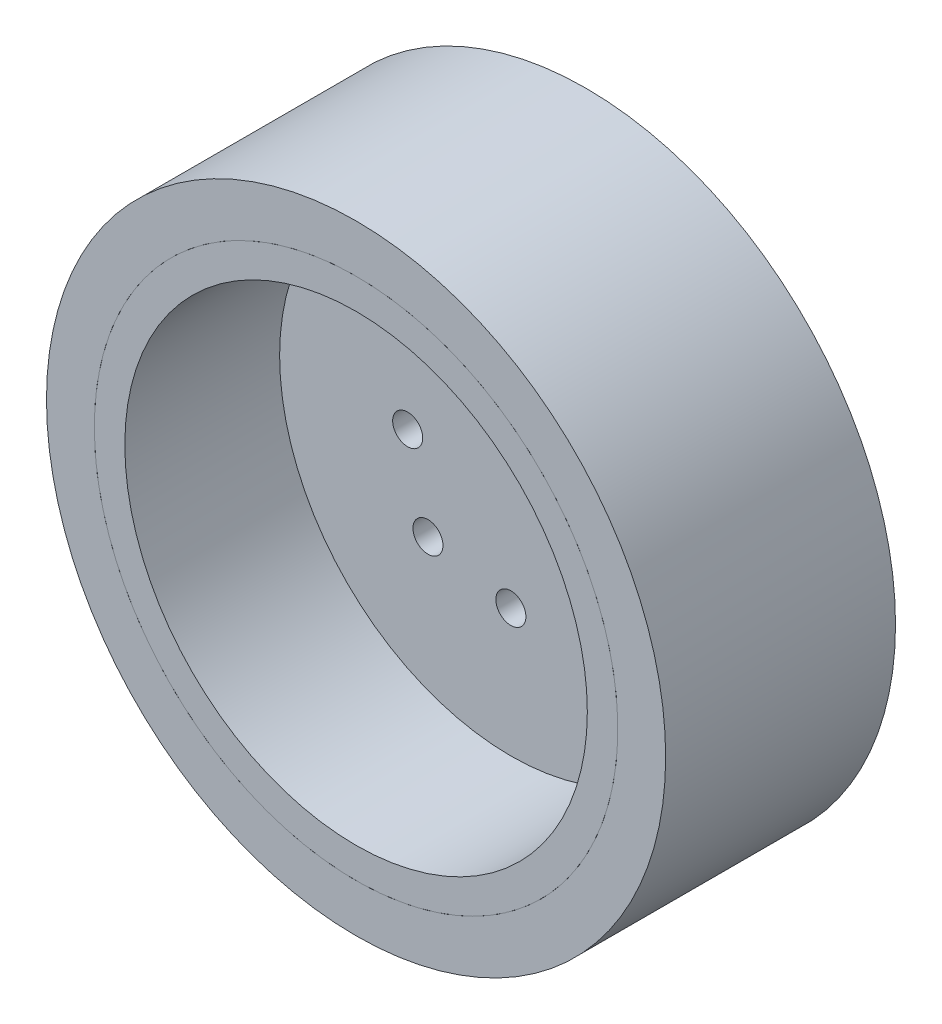
ISO-10303-21;
HEADER;
FILE_DESCRIPTION(('STEP AP214'),'2;1');
FILE_NAME('part.step','',(''),(''),'','','');
FILE_SCHEMA(('AUTOMOTIVE_DESIGN { 1 0 10303 214 1 1 1 1 }'));
ENDSEC;
DATA;
#1=APPLICATION_CONTEXT('core data for automotive mechanical design processes');
#2=APPLICATION_PROTOCOL_DEFINITION('international standard','automotive_design',2000,#1);
#3=PRODUCT_CONTEXT('',#1,'mechanical');
#4=PRODUCT('Part','Part','',(#3));
#5=PRODUCT_RELATED_PRODUCT_CATEGORY('part','',(#4));
#6=PRODUCT_DEFINITION_FORMATION('','',#4);
#7=PRODUCT_DEFINITION_CONTEXT('part definition',#1,'design');
#8=PRODUCT_DEFINITION('design','',#6,#7);
#9=PRODUCT_DEFINITION_SHAPE('','',#8);
#10=(LENGTH_UNIT() NAMED_UNIT(*) SI_UNIT(.MILLI.,.METRE.));
#11=(NAMED_UNIT(*) PLANE_ANGLE_UNIT() SI_UNIT($,.RADIAN.));
#12=(NAMED_UNIT(*) SI_UNIT($,.STERADIAN.) SOLID_ANGLE_UNIT());
#13=UNCERTAINTY_MEASURE_WITH_UNIT(LENGTH_MEASURE(1.E-05),#10,'distance_accuracy_value','');
#14=(GEOMETRIC_REPRESENTATION_CONTEXT(3) GLOBAL_UNCERTAINTY_ASSIGNED_CONTEXT((#13)) GLOBAL_UNIT_ASSIGNED_CONTEXT((#10,
#11,#12)) REPRESENTATION_CONTEXT('',''));
#15=CARTESIAN_POINT('',(0.,0.,0.));
#16=DIRECTION('',(0.,0.,1.));
#17=DIRECTION('',(1.,0.,0.));
#18=AXIS2_PLACEMENT_3D('',#15,#16,#17);
#19=CARTESIAN_POINT('',(-33.,0.,0.));
#20=DIRECTION('',(0.,0.,-1.));
#21=DIRECTION('',(-1.,0.,0.));
#22=AXIS2_PLACEMENT_3D('',#19,#20,#21);
#23=PLANE('',#22);
#24=CARTESIAN_POINT('',(0.,0.,0.));
#25=DIRECTION('',(0.,0.,-1.));
#26=DIRECTION('',(-1.,0.,0.));
#27=AXIS2_PLACEMENT_3D('',#24,#25,#26);
#28=CIRCLE('',#27,33.);
#29=CARTESIAN_POINT('',(-33.,0.,0.));
#30=VERTEX_POINT('',#29);
#31=EDGE_CURVE('E80',#30,#30,#28,.T.);
#32=ORIENTED_EDGE('',*,*,#31,.T.);
#33=EDGE_LOOP('',(#32));
#34=FACE_BOUND('',#33,.T.);
#35=CARTESIAN_POINT('',(0.,0.,0.));
#36=DIRECTION('',(0.,0.,-1.));
#37=DIRECTION('',(-1.,0.,0.));
#38=AXIS2_PLACEMENT_3D('',#35,#36,#37);
#39=CIRCLE('',#38,27.9);
#40=CARTESIAN_POINT('',(-27.9,0.,0.));
#41=VERTEX_POINT('',#40);
#42=EDGE_CURVE('E11',#41,#41,#39,.T.);
#43=ORIENTED_EDGE('',*,*,#42,.F.);
#44=EDGE_LOOP('',(#43));
#45=FACE_BOUND('',#44,.T.);
#46=ADVANCED_FACE('F52',(#34,#45),#23,.T.);
#47=CARTESIAN_POINT('',(0.,0.,-0.338387196240575));
#48=DIRECTION('',(0.,0.,-1.));
#49=DIRECTION('',(-1.,0.,0.));
#50=AXIS2_PLACEMENT_3D('',#47,#48,#49);
#51=CYLINDRICAL_SURFACE('',#50,27.9);
#52=ORIENTED_EDGE('',*,*,#42,.T.);
#53=EDGE_LOOP('',(#52));
#54=FACE_BOUND('',#53,.T.);
#55=CARTESIAN_POINT('',(0.,0.,1.5));
#56=DIRECTION('',(0.,0.,-1.));
#57=DIRECTION('',(-1.,0.,0.));
#58=AXIS2_PLACEMENT_3D('',#55,#56,#57);
#59=CIRCLE('',#58,27.9);
#60=CARTESIAN_POINT('',(-27.9,0.,1.5));
#61=VERTEX_POINT('',#60);
#62=EDGE_CURVE('E58',#61,#61,#59,.T.);
#63=ORIENTED_EDGE('',*,*,#62,.F.);
#64=EDGE_LOOP('',(#63));
#65=FACE_BOUND('',#64,.T.);
#66=ADVANCED_FACE('F98',(#54,#65),#51,.F.);
#67=CARTESIAN_POINT('',(-27.9,0.,1.5));
#68=DIRECTION('',(0.,0.,-1.));
#69=DIRECTION('',(-1.,0.,0.));
#70=AXIS2_PLACEMENT_3D('',#67,#68,#69);
#71=PLANE('',#70);
#72=ORIENTED_EDGE('',*,*,#62,.T.);
#73=EDGE_LOOP('',(#72));
#74=FACE_BOUND('',#73,.T.);
#75=CARTESIAN_POINT('',(0.,0.,1.5));
#76=DIRECTION('',(0.,0.,-1.));
#77=DIRECTION('',(-1.,0.,0.));
#78=AXIS2_PLACEMENT_3D('',#75,#76,#77);
#79=CIRCLE('',#78,26.4);
#80=CARTESIAN_POINT('',(-26.4,0.,1.5));
#81=VERTEX_POINT('',#80);
#82=EDGE_CURVE('E62',#81,#81,#79,.T.);
#83=ORIENTED_EDGE('',*,*,#82,.F.);
#84=EDGE_LOOP('',(#83));
#85=FACE_BOUND('',#84,.T.);
#86=ADVANCED_FACE('F102',(#74,#85),#71,.T.);
#87=CARTESIAN_POINT('',(0.,0.,-0.338387196240575));
#88=DIRECTION('',(0.,0.,-1.));
#89=DIRECTION('',(-1.,0.,0.));
#90=AXIS2_PLACEMENT_3D('',#87,#88,#89);
#91=CYLINDRICAL_SURFACE('',#90,26.4);
#92=ORIENTED_EDGE('',*,*,#82,.T.);
#93=EDGE_LOOP('',(#92));
#94=FACE_BOUND('',#93,.T.);
#95=CARTESIAN_POINT('',(0.,0.,23.));
#96=DIRECTION('',(0.,0.,-1.));
#97=DIRECTION('',(-1.,0.,0.));
#98=AXIS2_PLACEMENT_3D('',#95,#96,#97);
#99=CIRCLE('',#98,26.4);
#100=CARTESIAN_POINT('',(-26.4,0.,23.));
#101=VERTEX_POINT('',#100);
#102=EDGE_CURVE('E66',#101,#101,#99,.T.);
#103=ORIENTED_EDGE('',*,*,#102,.F.);
#104=EDGE_LOOP('',(#103));
#105=FACE_BOUND('',#104,.T.);
#106=ADVANCED_FACE('F106',(#94,#105),#91,.F.);
#107=CARTESIAN_POINT('',(-26.4,0.,23.));
#108=DIRECTION('',(0.,0.,1.));
#109=DIRECTION('',(1.,0.,0.));
#110=AXIS2_PLACEMENT_3D('',#107,#108,#109);
#111=PLANE('',#110);
#112=ORIENTED_EDGE('',*,*,#102,.T.);
#113=EDGE_LOOP('',(#112));
#114=FACE_BOUND('',#113,.T.);
#115=CARTESIAN_POINT('',(0.,0.,23.));
#116=DIRECTION('',(0.,0.,-1.));
#117=DIRECTION('',(-1.,0.,0.));
#118=AXIS2_PLACEMENT_3D('',#115,#116,#117);
#119=CIRCLE('',#118,27.9);
#120=CARTESIAN_POINT('',(-27.9,0.,23.));
#121=VERTEX_POINT('',#120);
#122=EDGE_CURVE('E71',#121,#121,#119,.T.);
#123=ORIENTED_EDGE('',*,*,#122,.F.);
#124=EDGE_LOOP('',(#123));
#125=FACE_BOUND('',#124,.T.);
#126=ADVANCED_FACE('F112',(#114,#125),#111,.T.);
#127=CARTESIAN_POINT('',(0.,0.,-0.338387196240575));
#128=DIRECTION('',(0.,0.,-1.));
#129=DIRECTION('',(-1.,0.,0.));
#130=AXIS2_PLACEMENT_3D('',#127,#128,#129);
#131=CYLINDRICAL_SURFACE('',#130,27.9);
#132=ORIENTED_EDGE('',*,*,#122,.T.);
#133=EDGE_LOOP('',(#132));
#134=FACE_BOUND('',#133,.T.);
#135=CARTESIAN_POINT('',(0.,0.,24.5));
#136=DIRECTION('',(0.,0.,-1.));
#137=DIRECTION('',(-1.,0.,0.));
#138=AXIS2_PLACEMENT_3D('',#135,#136,#137);
#139=CIRCLE('',#138,27.9);
#140=CARTESIAN_POINT('',(-27.9,0.,24.5));
#141=VERTEX_POINT('',#140);
#142=EDGE_CURVE('E74',#141,#141,#139,.T.);
#143=ORIENTED_EDGE('',*,*,#142,.F.);
#144=EDGE_LOOP('',(#143));
#145=FACE_BOUND('',#144,.T.);
#146=ADVANCED_FACE('F94',(#134,#145),#131,.F.);
#147=CARTESIAN_POINT('',(-33.,0.,24.5));
#148=DIRECTION('',(0.,0.,1.));
#149=DIRECTION('',(1.,0.,0.));
#150=AXIS2_PLACEMENT_3D('',#147,#148,#149);
#151=PLANE('',#150);
#152=ORIENTED_EDGE('',*,*,#142,.T.);
#153=EDGE_LOOP('',(#152));
#154=FACE_BOUND('',#153,.T.);
#155=CARTESIAN_POINT('',(0.,0.,24.5));
#156=DIRECTION('',(0.,0.,-1.));
#157=DIRECTION('',(-1.,0.,0.));
#158=AXIS2_PLACEMENT_3D('',#155,#156,#157);
#159=CIRCLE('',#158,33.);
#160=CARTESIAN_POINT('',(-33.,0.,24.5));
#161=VERTEX_POINT('',#160);
#162=EDGE_CURVE('E77',#161,#161,#159,.T.);
#163=ORIENTED_EDGE('',*,*,#162,.F.);
#164=EDGE_LOOP('',(#163));
#165=FACE_BOUND('',#164,.T.);
#166=ADVANCED_FACE('F88',(#154,#165),#151,.T.);
#167=CARTESIAN_POINT('',(0.,0.,-0.338387196240575));
#168=DIRECTION('',(0.,0.,-1.));
#169=DIRECTION('',(-1.,0.,0.));
#170=AXIS2_PLACEMENT_3D('',#167,#168,#169);
#171=CYLINDRICAL_SURFACE('',#170,33.);
#172=ORIENTED_EDGE('',*,*,#162,.T.);
#173=EDGE_LOOP('',(#172));
#174=FACE_BOUND('',#173,.T.);
#175=ORIENTED_EDGE('',*,*,#31,.F.);
#176=EDGE_LOOP('',(#175));
#177=FACE_BOUND('',#176,.T.);
#178=ADVANCED_FACE('F86',(#174,#177),#171,.T.);
#179=CLOSED_SHELL('',(#46,#66,#86,#106,#126,#146,#166,#178));
#180=MANIFOLD_SOLID_BREP('B2',#179);
#181=CARTESIAN_POINT('',(0.,0.,24.5));
#182=DIRECTION('',(0.,0.,-1.));
#183=DIRECTION('',(-1.,0.,0.));
#184=AXIS2_PLACEMENT_3D('',#181,#182,#183);
#185=CYLINDRICAL_SURFACE('',#184,26.4);
#186=CARTESIAN_POINT('',(0.,0.,23.));
#187=DIRECTION('',(0.,0.,1.));
#188=DIRECTION('',(1.,0.,0.));
#189=AXIS2_PLACEMENT_3D('',#186,#187,#188);
#190=CIRCLE('',#189,26.4);
#191=CARTESIAN_POINT('',(26.4,0.,23.));
#192=VERTEX_POINT('',#191);
#193=EDGE_CURVE('E181',#192,#192,#190,.T.);
#194=ORIENTED_EDGE('',*,*,#193,.F.);
#195=EDGE_LOOP('',(#194));
#196=FACE_BOUND('',#195,.T.);
#197=CARTESIAN_POINT('',(0.,0.,1.5));
#198=DIRECTION('',(0.,0.,-1.));
#199=DIRECTION('',(-1.,0.,0.));
#200=AXIS2_PLACEMENT_3D('',#197,#198,#199);
#201=CIRCLE('',#200,26.4);
#202=CARTESIAN_POINT('',(-26.4,0.,1.5));
#203=VERTEX_POINT('',#202);
#204=EDGE_CURVE('E51',#203,#203,#201,.T.);
#205=ORIENTED_EDGE('',*,*,#204,.F.);
#206=EDGE_LOOP('',(#205));
#207=FACE_BOUND('',#206,.T.);
#208=ADVANCED_FACE('F175',(#196,#207),#185,.T.);
#209=CARTESIAN_POINT('',(0.,0.,24.5));
#210=DIRECTION('',(0.,0.,1.));
#211=DIRECTION('',(1.,0.,0.));
#212=AXIS2_PLACEMENT_3D('',#209,#210,#211);
#213=PLANE('',#212);
#214=CARTESIAN_POINT('',(0.,0.,24.5));
#215=DIRECTION('',(0.,0.,1.));
#216=DIRECTION('',(1.,0.,0.));
#217=AXIS2_PLACEMENT_3D('',#214,#215,#216);
#218=CIRCLE('',#217,24.65);
#219=CARTESIAN_POINT('',(24.65,0.,24.5));
#220=VERTEX_POINT('',#219);
#221=EDGE_CURVE('E189',#220,#220,#218,.T.);
#222=ORIENTED_EDGE('',*,*,#221,.F.);
#223=EDGE_LOOP('',(#222));
#224=FACE_BOUND('',#223,.T.);
#225=CARTESIAN_POINT('',(0.,0.,24.5));
#226=DIRECTION('',(0.,0.,1.));
#227=DIRECTION('',(1.,0.,0.));
#228=AXIS2_PLACEMENT_3D('',#225,#226,#227);
#229=CIRCLE('',#228,27.9);
#230=CARTESIAN_POINT('',(27.9,0.,24.5));
#231=VERTEX_POINT('',#230);
#232=EDGE_CURVE('E195',#231,#231,#229,.T.);
#233=ORIENTED_EDGE('',*,*,#232,.T.);
#234=EDGE_LOOP('',(#233));
#235=FACE_BOUND('',#234,.T.);
#236=ADVANCED_FACE('F285',(#224,#235),#213,.T.);
#237=CARTESIAN_POINT('',(0.,0.,-69.7207286249936));
#238=DIRECTION('',(0.,0.,1.));
#239=DIRECTION('',(1.,0.,0.));
#240=AXIS2_PLACEMENT_3D('',#237,#238,#239);
#241=CYLINDRICAL_SURFACE('',#240,24.65);
#242=CARTESIAN_POINT('',(0.,0.,8.00000000000001));
#243=DIRECTION('',(0.,0.,1.));
#244=DIRECTION('',(1.,0.,0.));
#245=AXIS2_PLACEMENT_3D('',#242,#243,#244);
#246=CIRCLE('',#245,24.65);
#247=CARTESIAN_POINT('',(24.65,0.,7.99999999999999));
#248=VERTEX_POINT('',#247);
#249=EDGE_CURVE('E185',#248,#248,#246,.F.);
#250=CARTESIAN_POINT('',(24.65,0.,7.99999999999999));
#251=CARTESIAN_POINT('',(24.65,0.,8.17187499999999));
#252=CARTESIAN_POINT('',(24.65,0.,8.34375));
#253=CARTESIAN_POINT('',(24.65,0.,8.6875));
#254=CARTESIAN_POINT('',(24.65,0.,8.85937499999999));
#255=CARTESIAN_POINT('',(24.65,0.,9.20312499999999));
#256=CARTESIAN_POINT('',(24.65,0.,9.37499999999999));
#257=CARTESIAN_POINT('',(24.65,0.,9.71874999999999));
#258=CARTESIAN_POINT('',(24.65,0.,9.89062499999999));
#259=CARTESIAN_POINT('',(24.65,0.,10.234375));
#260=CARTESIAN_POINT('',(24.65,0.,10.40625));
#261=CARTESIAN_POINT('',(24.65,0.,10.75));
#262=CARTESIAN_POINT('',(24.65,0.,10.921875));
#263=CARTESIAN_POINT('',(24.65,0.,11.265625));
#264=CARTESIAN_POINT('',(24.65,0.,11.4375));
#265=CARTESIAN_POINT('',(24.65,0.,11.78125));
#266=CARTESIAN_POINT('',(24.65,0.,11.953125));
#267=CARTESIAN_POINT('',(24.65,0.,12.296875));
#268=CARTESIAN_POINT('',(24.65,0.,12.46875));
#269=CARTESIAN_POINT('',(24.65,0.,12.8125));
#270=CARTESIAN_POINT('',(24.65,0.,12.984375));
#271=CARTESIAN_POINT('',(24.65,0.,13.328125));
#272=CARTESIAN_POINT('',(24.65,0.,13.5));
#273=CARTESIAN_POINT('',(24.65,0.,13.84375));
#274=CARTESIAN_POINT('',(24.65,0.,14.015625));
#275=CARTESIAN_POINT('',(24.65,0.,14.359375));
#276=CARTESIAN_POINT('',(24.65,0.,14.53125));
#277=CARTESIAN_POINT('',(24.65,0.,14.875));
#278=CARTESIAN_POINT('',(24.65,0.,15.046875));
#279=CARTESIAN_POINT('',(24.65,0.,15.390625));
#280=CARTESIAN_POINT('',(24.65,0.,15.5625));
#281=CARTESIAN_POINT('',(24.65,0.,15.90625));
#282=CARTESIAN_POINT('',(24.65,0.,16.078125));
#283=CARTESIAN_POINT('',(24.65,0.,16.421875));
#284=CARTESIAN_POINT('',(24.65,0.,16.59375));
#285=CARTESIAN_POINT('',(24.65,0.,16.9375));
#286=CARTESIAN_POINT('',(24.65,0.,17.109375));
#287=CARTESIAN_POINT('',(24.65,0.,17.453125));
#288=CARTESIAN_POINT('',(24.65,0.,17.625));
#289=CARTESIAN_POINT('',(24.65,0.,17.96875));
#290=CARTESIAN_POINT('',(24.65,0.,18.140625));
#291=CARTESIAN_POINT('',(24.65,0.,18.484375));
#292=CARTESIAN_POINT('',(24.65,0.,18.65625));
#293=CARTESIAN_POINT('',(24.65,0.,19.));
#294=CARTESIAN_POINT('',(24.65,0.,19.171875));
#295=CARTESIAN_POINT('',(24.65,0.,19.515625));
#296=CARTESIAN_POINT('',(24.65,0.,19.6875));
#297=CARTESIAN_POINT('',(24.65,0.,20.03125));
#298=CARTESIAN_POINT('',(24.65,0.,20.203125));
#299=CARTESIAN_POINT('',(24.65,0.,20.546875));
#300=CARTESIAN_POINT('',(24.65,0.,20.71875));
#301=CARTESIAN_POINT('',(24.65,0.,21.0625));
#302=CARTESIAN_POINT('',(24.65,0.,21.234375));
#303=CARTESIAN_POINT('',(24.65,0.,21.578125));
#304=CARTESIAN_POINT('',(24.65,0.,21.75));
#305=CARTESIAN_POINT('',(24.65,0.,22.09375));
#306=CARTESIAN_POINT('',(24.65,0.,22.265625));
#307=CARTESIAN_POINT('',(24.65,0.,22.609375));
#308=CARTESIAN_POINT('',(24.65,0.,22.78125));
#309=CARTESIAN_POINT('',(24.65,0.,23.125));
#310=CARTESIAN_POINT('',(24.65,0.,23.296875));
#311=CARTESIAN_POINT('',(24.65,0.,23.640625));
#312=CARTESIAN_POINT('',(24.65,0.,23.8125));
#313=CARTESIAN_POINT('',(24.65,0.,24.15625));
#314=CARTESIAN_POINT('',(24.65,0.,24.328125));
#315=CARTESIAN_POINT('',(24.65,0.,24.5));
#316=B_SPLINE_CURVE_WITH_KNOTS('',3,(#250,#251,#252,#253,#254,#255,#256,#257,#258,#259,#260,
#261,#262,#263,#264,#265,#266,#267,#268,#269,#270,#271,#272,#273,#274,#275,#276,#277,#278,#279,
#280,#281,#282,#283,#284,#285,#286,#287,#288,#289,#290,#291,#292,#293,#294,#295,#296,#297,#298,
#299,#300,#301,#302,#303,#304,#305,#306,#307,#308,#309,#310,#311,#312,#313,#314,#315),
.UNSPECIFIED.,.F.,.F.,(4,2,2,2,2,2,2,2,2,2,2,2,2,2,2,2,2,2,2,2,2,2,2,2,2,2,2,2,2,2,2,2,4),(0.,
0.515625000000006,1.03125,1.546875,2.06249999999999,2.578125,3.09375000000001,3.609375,4.125,
4.64062500000001,5.15625,5.67187500000001,6.18750000000001,6.703125,7.21875000000001,7.734375,
8.25000000000001,8.76562500000001,9.28125000000001,9.79687500000001,10.3125,10.828125,11.34375,
11.859375,12.375,12.890625,13.40625,13.921875,14.4375,14.953125,15.46875,15.984375,16.5),.UNSPECIFIED.);
#317=EDGE_CURVE('BSEAM291',#248,#220,#316,.T.);
#318=ORIENTED_EDGE('',*,*,#249,.T.);
#319=ORIENTED_EDGE('',*,*,#221,.T.);
#320=ORIENTED_EDGE('',*,*,#317,.T.);
#321=ORIENTED_EDGE('',*,*,#317,.F.);
#322=EDGE_LOOP('',(#318,#320,#319,#321));
#323=FACE_BOUND('',#322,.T.);
#324=ADVANCED_FACE('F291',(#323),#241,.F.);
#325=CARTESIAN_POINT('',(0.,0.,8.));
#326=DIRECTION('',(0.,0.,1.));
#327=DIRECTION('',(1.,0.,0.));
#328=AXIS2_PLACEMENT_3D('',#325,#326,#327);
#329=PLANE('',#328);
#330=CARTESIAN_POINT('',(-8.83883476483185,8.83883476483184,8.));
#331=DIRECTION('',(0.,0.,1.));
#332=DIRECTION('',(1.,0.,0.));
#333=AXIS2_PLACEMENT_3D('',#330,#331,#332);
#334=CIRCLE('',#333,1.6);
#335=CARTESIAN_POINT('',(-7.23883476483184,8.83883476483184,8.));
#336=VERTEX_POINT('',#335);
#337=EDGE_CURVE('E204',#336,#336,#334,.T.);
#338=ORIENTED_EDGE('',*,*,#337,.F.);
#339=EDGE_LOOP('',(#338));
#340=FACE_BOUND('',#339,.T.);
#341=CARTESIAN_POINT('',(11.,0.,8.));
#342=DIRECTION('',(0.,0.,1.));
#343=DIRECTION('',(1.,0.,0.));
#344=AXIS2_PLACEMENT_3D('',#341,#342,#343);
#345=CIRCLE('',#344,1.6);
#346=CARTESIAN_POINT('',(12.6,0.,8.));
#347=VERTEX_POINT('',#346);
#348=EDGE_CURVE('E209',#347,#347,#345,.T.);
#349=ORIENTED_EDGE('',*,*,#348,.F.);
#350=EDGE_LOOP('',(#349));
#351=FACE_BOUND('',#350,.T.);
#352=CARTESIAN_POINT('',(0.,-11.,8.));
#353=DIRECTION('',(0.,0.,1.));
#354=DIRECTION('',(1.,0.,0.));
#355=AXIS2_PLACEMENT_3D('',#352,#353,#354);
#356=CIRCLE('',#355,1.6);
#357=CARTESIAN_POINT('',(1.6,-11.,8.));
#358=VERTEX_POINT('',#357);
#359=EDGE_CURVE('E212',#358,#358,#356,.T.);
#360=ORIENTED_EDGE('',*,*,#359,.F.);
#361=EDGE_LOOP('',(#360));
#362=FACE_BOUND('',#361,.T.);
#363=CARTESIAN_POINT('',(-11.,0.,8.));
#364=DIRECTION('',(0.,0.,1.));
#365=DIRECTION('',(1.,0.,0.));
#366=AXIS2_PLACEMENT_3D('',#363,#364,#365);
#367=CIRCLE('',#366,1.6);
#368=CARTESIAN_POINT('',(-9.4,0.,8.));
#369=VERTEX_POINT('',#368);
#370=EDGE_CURVE('E215',#369,#369,#367,.T.);
#371=ORIENTED_EDGE('',*,*,#370,.F.);
#372=EDGE_LOOP('',(#371));
#373=FACE_BOUND('',#372,.T.);
#374=CARTESIAN_POINT('',(8.83883476483184,8.83883476483185,8.));
#375=DIRECTION('',(0.,0.,1.));
#376=DIRECTION('',(1.,0.,0.));
#377=AXIS2_PLACEMENT_3D('',#374,#375,#376);
#378=CIRCLE('',#377,1.6);
#379=CARTESIAN_POINT('',(10.4388347648318,8.83883476483185,8.));
#380=VERTEX_POINT('',#379);
#381=EDGE_CURVE('E218',#380,#380,#378,.T.);
#382=ORIENTED_EDGE('',*,*,#381,.F.);
#383=EDGE_LOOP('',(#382));
#384=FACE_BOUND('',#383,.T.);
#385=CARTESIAN_POINT('',(8.83883476483184,-8.83883476483185,8.));
#386=DIRECTION('',(0.,0.,1.));
#387=DIRECTION('',(1.,0.,0.));
#388=AXIS2_PLACEMENT_3D('',#385,#386,#387);
#389=CIRCLE('',#388,1.6);
#390=CARTESIAN_POINT('',(10.4388347648318,-8.83883476483185,8.));
#391=VERTEX_POINT('',#390);
#392=EDGE_CURVE('E221',#391,#391,#389,.T.);
#393=ORIENTED_EDGE('',*,*,#392,.F.);
#394=EDGE_LOOP('',(#393));
#395=FACE_BOUND('',#394,.T.);
#396=CARTESIAN_POINT('',(-8.83883476483184,-8.83883476483184,8.));
#397=DIRECTION('',(0.,0.,1.));
#398=DIRECTION('',(1.,0.,0.));
#399=AXIS2_PLACEMENT_3D('',#396,#397,#398);
#400=CIRCLE('',#399,1.6);
#401=CARTESIAN_POINT('',(-7.23883476483183,-8.83883476483184,8.));
#402=VERTEX_POINT('',#401);
#403=EDGE_CURVE('E224',#402,#402,#400,.T.);
#404=ORIENTED_EDGE('',*,*,#403,.F.);
#405=EDGE_LOOP('',(#404));
#406=FACE_BOUND('',#405,.T.);
#407=CARTESIAN_POINT('',(0.,11.,8.));
#408=DIRECTION('',(0.,0.,1.));
#409=DIRECTION('',(1.,0.,0.));
#410=AXIS2_PLACEMENT_3D('',#407,#408,#409);
#411=CIRCLE('',#410,1.6);
#412=CARTESIAN_POINT('',(1.6,11.,8.));
#413=VERTEX_POINT('',#412);
#414=EDGE_CURVE('E227',#413,#413,#411,.T.);
#415=ORIENTED_EDGE('',*,*,#414,.F.);
#416=EDGE_LOOP('',(#415));
#417=FACE_BOUND('',#416,.T.);
#418=ORIENTED_EDGE('',*,*,#249,.F.);
#419=EDGE_LOOP('',(#418));
#420=FACE_BOUND('',#419,.T.);
#421=ADVANCED_FACE('F299',(#340,#351,#362,#373,#384,#395,#406,#417,#420),#329,.T.);
#422=CARTESIAN_POINT('',(0.,0.,23.));
#423=DIRECTION('',(0.,0.,1.));
#424=DIRECTION('',(1.,0.,0.));
#425=AXIS2_PLACEMENT_3D('',#422,#423,#424);
#426=CYLINDRICAL_SURFACE('',#425,27.9);
#427=CARTESIAN_POINT('',(0.,0.,23.));
#428=DIRECTION('',(0.,0.,1.));
#429=DIRECTION('',(1.,0.,0.));
#430=AXIS2_PLACEMENT_3D('',#427,#428,#429);
#431=CIRCLE('',#430,27.9);
#432=CARTESIAN_POINT('',(27.9,0.,23.));
#433=VERTEX_POINT('',#432);
#434=EDGE_CURVE('E194',#433,#433,#431,.T.);
#435=ORIENTED_EDGE('',*,*,#434,.T.);
#436=EDGE_LOOP('',(#435));
#437=FACE_BOUND('',#436,.T.);
#438=ORIENTED_EDGE('',*,*,#232,.F.);
#439=EDGE_LOOP('',(#438));
#440=FACE_BOUND('',#439,.T.);
#441=ADVANCED_FACE('F306',(#437,#440),#426,.T.);
#442=CARTESIAN_POINT('',(0.,0.,23.));
#443=DIRECTION('',(0.,0.,1.));
#444=DIRECTION('',(1.,0.,0.));
#445=AXIS2_PLACEMENT_3D('',#442,#443,#444);
#446=PLANE('',#445);
#447=ORIENTED_EDGE('',*,*,#193,.T.);
#448=EDGE_LOOP('',(#447));
#449=FACE_BOUND('',#448,.T.);
#450=ORIENTED_EDGE('',*,*,#434,.F.);
#451=EDGE_LOOP('',(#450));
#452=FACE_BOUND('',#451,.T.);
#453=ADVANCED_FACE('F279',(#449,#452),#446,.F.);
#454=CARTESIAN_POINT('',(0.,0.,1.5));
#455=DIRECTION('',(0.,0.,-1.));
#456=DIRECTION('',(1.,0.,0.));
#457=AXIS2_PLACEMENT_3D('',#454,#455,#456);
#458=PLANE('',#457);
#459=CARTESIAN_POINT('',(0.,0.,1.5));
#460=DIRECTION('',(0.,0.,1.));
#461=DIRECTION('',(1.,0.,0.));
#462=AXIS2_PLACEMENT_3D('',#459,#460,#461);
#463=CIRCLE('',#462,27.9);
#464=CARTESIAN_POINT('',(27.9,0.,1.5));
#465=VERTEX_POINT('',#464);
#466=EDGE_CURVE('E198',#465,#465,#463,.T.);
#467=ORIENTED_EDGE('',*,*,#466,.T.);
#468=EDGE_LOOP('',(#467));
#469=FACE_BOUND('',#468,.T.);
#470=ORIENTED_EDGE('',*,*,#204,.T.);
#471=EDGE_LOOP('',(#470));
#472=FACE_BOUND('',#471,.T.);
#473=ADVANCED_FACE('F272',(#469,#472),#458,.F.);
#474=CARTESIAN_POINT('',(0.,0.,1.5));
#475=DIRECTION('',(0.,0.,-1.));
#476=DIRECTION('',(-1.,0.,0.));
#477=AXIS2_PLACEMENT_3D('',#474,#475,#476);
#478=CYLINDRICAL_SURFACE('',#477,27.9);
#479=ORIENTED_EDGE('',*,*,#466,.F.);
#480=EDGE_LOOP('',(#479));
#481=FACE_BOUND('',#480,.T.);
#482=CARTESIAN_POINT('',(0.,0.,0.));
#483=DIRECTION('',(0.,0.,1.));
#484=DIRECTION('',(1.,0.,0.));
#485=AXIS2_PLACEMENT_3D('',#482,#483,#484);
#486=CIRCLE('',#485,27.9);
#487=CARTESIAN_POINT('',(27.9,0.,0.));
#488=VERTEX_POINT('',#487);
#489=EDGE_CURVE('E201',#488,#488,#486,.T.);
#490=ORIENTED_EDGE('',*,*,#489,.T.);
#491=EDGE_LOOP('',(#490));
#492=FACE_BOUND('',#491,.T.);
#493=ADVANCED_FACE('F261',(#481,#492),#478,.T.);
#494=CARTESIAN_POINT('',(0.,0.,0.));
#495=DIRECTION('',(0.,0.,1.));
#496=DIRECTION('',(1.,0.,0.));
#497=AXIS2_PLACEMENT_3D('',#494,#495,#496);
#498=PLANE('',#497);
#499=CARTESIAN_POINT('',(-8.83883476483185,8.83883476483184,0.));
#500=DIRECTION('',(0.,0.,-1.));
#501=DIRECTION('',(-1.,0.,0.));
#502=AXIS2_PLACEMENT_3D('',#499,#500,#501);
#503=CIRCLE('',#502,1.6);
#504=CARTESIAN_POINT('',(-10.4388347648318,8.83883476483184,0.));
#505=VERTEX_POINT('',#504);
#506=EDGE_CURVE('E240',#505,#505,#503,.T.);
#507=ORIENTED_EDGE('',*,*,#506,.F.);
#508=EDGE_LOOP('',(#507));
#509=FACE_BOUND('',#508,.T.);
#510=CARTESIAN_POINT('',(11.,0.,0.));
#511=DIRECTION('',(0.,0.,-1.));
#512=DIRECTION('',(-1.,0.,0.));
#513=AXIS2_PLACEMENT_3D('',#510,#511,#512);
#514=CIRCLE('',#513,1.6);
#515=CARTESIAN_POINT('',(9.4,0.,0.));
#516=VERTEX_POINT('',#515);
#517=EDGE_CURVE('E237',#516,#516,#514,.T.);
#518=ORIENTED_EDGE('',*,*,#517,.F.);
#519=EDGE_LOOP('',(#518));
#520=FACE_BOUND('',#519,.T.);
#521=CARTESIAN_POINT('',(0.,-11.,0.));
#522=DIRECTION('',(0.,0.,-1.));
#523=DIRECTION('',(-1.,0.,0.));
#524=AXIS2_PLACEMENT_3D('',#521,#522,#523);
#525=CIRCLE('',#524,1.6);
#526=CARTESIAN_POINT('',(-1.6,-11.,0.));
#527=VERTEX_POINT('',#526);
#528=EDGE_CURVE('E234',#527,#527,#525,.T.);
#529=ORIENTED_EDGE('',*,*,#528,.F.);
#530=EDGE_LOOP('',(#529));
#531=FACE_BOUND('',#530,.T.);
#532=CARTESIAN_POINT('',(-11.,0.,0.));
#533=DIRECTION('',(0.,0.,-1.));
#534=DIRECTION('',(-1.,0.,0.));
#535=AXIS2_PLACEMENT_3D('',#532,#533,#534);
#536=CIRCLE('',#535,1.6);
#537=CARTESIAN_POINT('',(-12.6,0.,0.));
#538=VERTEX_POINT('',#537);
#539=EDGE_CURVE('E233',#538,#538,#536,.T.);
#540=ORIENTED_EDGE('',*,*,#539,.F.);
#541=EDGE_LOOP('',(#540));
#542=FACE_BOUND('',#541,.T.);
#543=CARTESIAN_POINT('',(8.83883476483184,8.83883476483185,0.));
#544=DIRECTION('',(0.,0.,-1.));
#545=DIRECTION('',(-1.,0.,0.));
#546=AXIS2_PLACEMENT_3D('',#543,#544,#545);
#547=CIRCLE('',#546,1.6);
#548=CARTESIAN_POINT('',(7.23883476483184,8.83883476483185,0.));
#549=VERTEX_POINT('',#548);
#550=EDGE_CURVE('E243',#549,#549,#547,.T.);
#551=ORIENTED_EDGE('',*,*,#550,.F.);
#552=EDGE_LOOP('',(#551));
#553=FACE_BOUND('',#552,.T.);
#554=CARTESIAN_POINT('',(8.83883476483184,-8.83883476483185,0.));
#555=DIRECTION('',(0.,0.,-1.));
#556=DIRECTION('',(-1.,0.,0.));
#557=AXIS2_PLACEMENT_3D('',#554,#555,#556);
#558=CIRCLE('',#557,1.6);
#559=CARTESIAN_POINT('',(7.23883476483184,-8.83883476483185,0.));
#560=VERTEX_POINT('',#559);
#561=EDGE_CURVE('E249',#560,#560,#558,.T.);
#562=ORIENTED_EDGE('',*,*,#561,.F.);
#563=EDGE_LOOP('',(#562));
#564=FACE_BOUND('',#563,.T.);
#565=CARTESIAN_POINT('',(-8.83883476483184,-8.83883476483184,0.));
#566=DIRECTION('',(0.,0.,-1.));
#567=DIRECTION('',(-1.,0.,0.));
#568=AXIS2_PLACEMENT_3D('',#565,#566,#567);
#569=CIRCLE('',#568,1.6);
#570=CARTESIAN_POINT('',(-10.4388347648318,-8.83883476483184,0.));
#571=VERTEX_POINT('',#570);
#572=EDGE_CURVE('E246',#571,#571,#569,.T.);
#573=ORIENTED_EDGE('',*,*,#572,.F.);
#574=EDGE_LOOP('',(#573));
#575=FACE_BOUND('',#574,.T.);
#576=CARTESIAN_POINT('',(0.,11.,0.));
#577=DIRECTION('',(0.,0.,-1.));
#578=DIRECTION('',(-1.,0.,0.));
#579=AXIS2_PLACEMENT_3D('',#576,#577,#578);
#580=CIRCLE('',#579,1.6);
#581=CARTESIAN_POINT('',(-1.6,11.,0.));
#582=VERTEX_POINT('',#581);
#583=EDGE_CURVE('E230',#582,#582,#580,.T.);
#584=ORIENTED_EDGE('',*,*,#583,.F.);
#585=EDGE_LOOP('',(#584));
#586=FACE_BOUND('',#585,.T.);
#587=ORIENTED_EDGE('',*,*,#489,.F.);
#588=EDGE_LOOP('',(#587));
#589=FACE_BOUND('',#588,.T.);
#590=ADVANCED_FACE('F257',(#509,#520,#531,#542,#553,#564,#575,#586,#589),#498,.F.);
#591=CARTESIAN_POINT('',(0.,11.,24.5));
#592=DIRECTION('',(0.,0.,-1.));
#593=DIRECTION('',(-1.,0.,0.));
#594=AXIS2_PLACEMENT_3D('',#591,#592,#593);
#595=CYLINDRICAL_SURFACE('',#594,1.6);
#596=ORIENTED_EDGE('',*,*,#414,.T.);
#597=EDGE_LOOP('',(#596));
#598=FACE_BOUND('',#597,.T.);
#599=ORIENTED_EDGE('',*,*,#583,.T.);
#600=EDGE_LOOP('',(#599));
#601=FACE_BOUND('',#600,.T.);
#602=ADVANCED_FACE('F260',(#598,#601),#595,.F.);
#603=CARTESIAN_POINT('',(-8.83883476483184,-8.83883476483184,24.5));
#604=DIRECTION('',(0.,0.,-1.));
#605=DIRECTION('',(-1.,0.,0.));
#606=AXIS2_PLACEMENT_3D('',#603,#604,#605);
#607=CYLINDRICAL_SURFACE('',#606,1.6);
#608=ORIENTED_EDGE('',*,*,#403,.T.);
#609=EDGE_LOOP('',(#608));
#610=FACE_BOUND('',#609,.T.);
#611=ORIENTED_EDGE('',*,*,#572,.T.);
#612=EDGE_LOOP('',(#611));
#613=FACE_BOUND('',#612,.T.);
#614=ADVANCED_FACE('F361',(#610,#613),#607,.F.);
#615=CARTESIAN_POINT('',(8.83883476483184,-8.83883476483185,24.5));
#616=DIRECTION('',(0.,0.,-1.));
#617=DIRECTION('',(-1.,0.,0.));
#618=AXIS2_PLACEMENT_3D('',#615,#616,#617);
#619=CYLINDRICAL_SURFACE('',#618,1.6);
#620=ORIENTED_EDGE('',*,*,#392,.T.);
#621=EDGE_LOOP('',(#620));
#622=FACE_BOUND('',#621,.T.);
#623=ORIENTED_EDGE('',*,*,#561,.T.);
#624=EDGE_LOOP('',(#623));
#625=FACE_BOUND('',#624,.T.);
#626=ADVANCED_FACE('F371',(#622,#625),#619,.F.);
#627=CARTESIAN_POINT('',(8.83883476483184,8.83883476483185,24.5));
#628=DIRECTION('',(0.,0.,-1.));
#629=DIRECTION('',(-1.,0.,0.));
#630=AXIS2_PLACEMENT_3D('',#627,#628,#629);
#631=CYLINDRICAL_SURFACE('',#630,1.6);
#632=ORIENTED_EDGE('',*,*,#381,.T.);
#633=EDGE_LOOP('',(#632));
#634=FACE_BOUND('',#633,.T.);
#635=ORIENTED_EDGE('',*,*,#550,.T.);
#636=EDGE_LOOP('',(#635));
#637=FACE_BOUND('',#636,.T.);
#638=ADVANCED_FACE('F255',(#634,#637),#631,.F.);
#639=CARTESIAN_POINT('',(-11.,0.,24.5));
#640=DIRECTION('',(0.,0.,-1.));
#641=DIRECTION('',(-1.,0.,0.));
#642=AXIS2_PLACEMENT_3D('',#639,#640,#641);
#643=CYLINDRICAL_SURFACE('',#642,1.6);
#644=ORIENTED_EDGE('',*,*,#370,.T.);
#645=EDGE_LOOP('',(#644));
#646=FACE_BOUND('',#645,.T.);
#647=ORIENTED_EDGE('',*,*,#539,.T.);
#648=EDGE_LOOP('',(#647));
#649=FACE_BOUND('',#648,.T.);
#650=ADVANCED_FACE('F390',(#646,#649),#643,.F.);
#651=CARTESIAN_POINT('',(0.,-11.,24.5));
#652=DIRECTION('',(0.,0.,-1.));
#653=DIRECTION('',(-1.,0.,0.));
#654=AXIS2_PLACEMENT_3D('',#651,#652,#653);
#655=CYLINDRICAL_SURFACE('',#654,1.6);
#656=ORIENTED_EDGE('',*,*,#359,.T.);
#657=EDGE_LOOP('',(#656));
#658=FACE_BOUND('',#657,.T.);
#659=ORIENTED_EDGE('',*,*,#528,.T.);
#660=EDGE_LOOP('',(#659));
#661=FACE_BOUND('',#660,.T.);
#662=ADVANCED_FACE('F400',(#658,#661),#655,.F.);
#663=CARTESIAN_POINT('',(11.,0.,24.5));
#664=DIRECTION('',(0.,0.,-1.));
#665=DIRECTION('',(-1.,0.,0.));
#666=AXIS2_PLACEMENT_3D('',#663,#664,#665);
#667=CYLINDRICAL_SURFACE('',#666,1.6);
#668=ORIENTED_EDGE('',*,*,#348,.T.);
#669=EDGE_LOOP('',(#668));
#670=FACE_BOUND('',#669,.T.);
#671=ORIENTED_EDGE('',*,*,#517,.T.);
#672=EDGE_LOOP('',(#671));
#673=FACE_BOUND('',#672,.T.);
#674=ADVANCED_FACE('F410',(#670,#673),#667,.F.);
#675=CARTESIAN_POINT('',(-8.83883476483185,8.83883476483184,24.5));
#676=DIRECTION('',(0.,0.,-1.));
#677=DIRECTION('',(-1.,0.,0.));
#678=AXIS2_PLACEMENT_3D('',#675,#676,#677);
#679=CYLINDRICAL_SURFACE('',#678,1.6);
#680=ORIENTED_EDGE('',*,*,#337,.T.);
#681=EDGE_LOOP('',(#680));
#682=FACE_BOUND('',#681,.T.);
#683=ORIENTED_EDGE('',*,*,#506,.T.);
#684=EDGE_LOOP('',(#683));
#685=FACE_BOUND('',#684,.T.);
#686=ADVANCED_FACE('F420',(#682,#685),#679,.F.);
#687=CLOSED_SHELL('',(#208,#236,#324,#421,#441,#453,#473,#493,#590,#602,#614,#626,#638,#650,
#662,#674,#686));
#688=MANIFOLD_SOLID_BREP('B6',#687);
#689=ADVANCED_BREP_SHAPE_REPRESENTATION('',(#18,#180,#688),#14);
#690=SHAPE_DEFINITION_REPRESENTATION(#9,#689);
ENDSEC;
END-ISO-10303-21;
